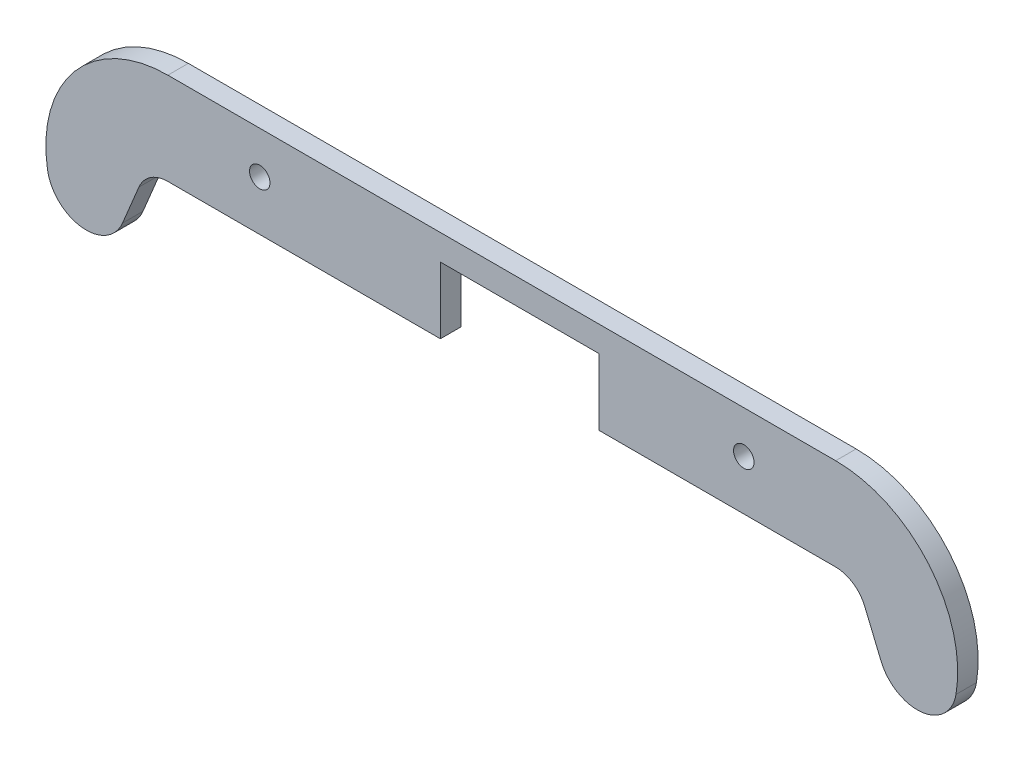
ISO-10303-21;
HEADER;
FILE_DESCRIPTION(('STEP AP214'),'2;1');
FILE_NAME('part.step','',(''),(''),'','','');
FILE_SCHEMA(('AUTOMOTIVE_DESIGN { 1 0 10303 214 1 1 1 1 }'));
ENDSEC;
DATA;
#1=APPLICATION_CONTEXT('core data for automotive mechanical design processes');
#2=APPLICATION_PROTOCOL_DEFINITION('international standard','automotive_design',2000,#1);
#3=PRODUCT_CONTEXT('',#1,'mechanical');
#4=PRODUCT('Part','Part','',(#3));
#5=PRODUCT_RELATED_PRODUCT_CATEGORY('part','',(#4));
#6=PRODUCT_DEFINITION_FORMATION('','',#4);
#7=PRODUCT_DEFINITION_CONTEXT('part definition',#1,'design');
#8=PRODUCT_DEFINITION('design','',#6,#7);
#9=PRODUCT_DEFINITION_SHAPE('','',#8);
#10=(LENGTH_UNIT() NAMED_UNIT(*) SI_UNIT(.MILLI.,.METRE.));
#11=(NAMED_UNIT(*) PLANE_ANGLE_UNIT() SI_UNIT($,.RADIAN.));
#12=(NAMED_UNIT(*) SI_UNIT($,.STERADIAN.) SOLID_ANGLE_UNIT());
#13=UNCERTAINTY_MEASURE_WITH_UNIT(LENGTH_MEASURE(1.E-05),#10,'distance_accuracy_value','');
#14=(GEOMETRIC_REPRESENTATION_CONTEXT(3) GLOBAL_UNCERTAINTY_ASSIGNED_CONTEXT((#13)) GLOBAL_UNIT_ASSIGNED_CONTEXT((#10,
#11,#12)) REPRESENTATION_CONTEXT('',''));
#15=CARTESIAN_POINT('',(0.,0.,0.));
#16=DIRECTION('',(0.,0.,1.));
#17=DIRECTION('',(1.,0.,0.));
#18=AXIS2_PLACEMENT_3D('',#15,#16,#17);
#19=CARTESIAN_POINT('',(0.,0.,4.));
#20=DIRECTION('',(0.,0.,1.));
#21=DIRECTION('',(1.,0.,0.));
#22=AXIS2_PLACEMENT_3D('',#19,#20,#21);
#23=PLANE('',#22);
#24=CARTESIAN_POINT('',(47.3247005645248,132.534767609621,4.));
#25=DIRECTION('',(0.,0.,1.));
#26=DIRECTION('',(1.,0.,0.));
#27=AXIS2_PLACEMENT_3D('',#24,#25,#26);
#28=CIRCLE('',#27,2.);
#29=CARTESIAN_POINT('',(49.3247005645248,132.534767609621,4.));
#30=VERTEX_POINT('',#29);
#31=EDGE_CURVE('E213',#30,#30,#28,.F.);
#32=ORIENTED_EDGE('',*,*,#31,.T.);
#33=EDGE_LOOP('',(#32));
#34=FACE_BOUND('',#33,.T.);
#35=CARTESIAN_POINT('',(-47.3247005645248,132.534767609621,4.));
#36=DIRECTION('',(0.,0.,1.));
#37=DIRECTION('',(1.,0.,0.));
#38=AXIS2_PLACEMENT_3D('',#35,#36,#37);
#39=CIRCLE('',#38,2.);
#40=CARTESIAN_POINT('',(-45.3247005645248,132.534767609621,4.));
#41=VERTEX_POINT('',#40);
#42=EDGE_CURVE('E208',#41,#41,#39,.T.);
#43=ORIENTED_EDGE('',*,*,#42,.F.);
#44=EDGE_LOOP('',(#43));
#45=FACE_BOUND('',#44,.T.);
#46=DIRECTION('',(1.,0.,0.));
#47=VECTOR('',#46,1.);
#48=CARTESIAN_POINT('',(0.,135.794563760221,4.));
#49=LINE('',#48,#47);
#50=CARTESIAN_POINT('',(-11.9997005645248,135.794563760221,4.));
#51=VERTEX_POINT('',#50);
#52=CARTESIAN_POINT('',(19.0002994354752,135.794563760221,4.));
#53=VERTEX_POINT('',#52);
#54=EDGE_CURVE('E266',#51,#53,#49,.T.);
#55=ORIENTED_EDGE('',*,*,#54,.T.);
#56=DIRECTION('',(0.,-1.,0.));
#57=VECTOR('',#56,1.);
#58=CARTESIAN_POINT('',(19.0002994354753,0.,4.));
#59=LINE('',#58,#57);
#60=CARTESIAN_POINT('',(19.0002994354753,122.794563760221,4.));
#61=VERTEX_POINT('',#60);
#62=EDGE_CURVE('E268',#53,#61,#59,.T.);
#63=ORIENTED_EDGE('',*,*,#62,.T.);
#64=DIRECTION('',(1.,0.,0.));
#65=VECTOR('',#64,1.);
#66=CARTESIAN_POINT('',(-1.16983781561408E-13,122.794563760221,4.));
#67=LINE('',#66,#65);
#68=CARTESIAN_POINT('',(65.2744208967918,122.794563760221,4.));
#69=VERTEX_POINT('',#68);
#70=EDGE_CURVE('E226',#61,#69,#67,.T.);
#71=ORIENTED_EDGE('',*,*,#70,.T.);
#72=CARTESIAN_POINT('',(65.2744208967918,116.631859433558,4.));
#73=DIRECTION('',(0.,0.,1.));
#74=DIRECTION('',(1.,0.,0.));
#75=AXIS2_PLACEMENT_3D('',#72,#73,#74);
#76=CIRCLE('',#75,6.16270432666299);
#77=CARTESIAN_POINT('',(70.9654319070403,118.996456291185,4.));
#78=VERTEX_POINT('',#77);
#79=EDGE_CURVE('E230',#78,#69,#76,.T.);
#80=ORIENTED_EDGE('',*,*,#79,.F.);
#81=DIRECTION('',(-0.383694678876073,0.923460011804619,0.));
#82=VECTOR('',#81,1.);
#83=CARTESIAN_POINT('',(102.681407807582,42.6637962571668,4.));
#84=LINE('',#83,#82);
#85=CARTESIAN_POINT('',(74.1610001277596,111.305498794792,4.));
#86=VERTEX_POINT('',#85);
#87=EDGE_CURVE('E233',#86,#78,#84,.T.);
#88=ORIENTED_EDGE('',*,*,#87,.F.);
#89=CARTESIAN_POINT('',(81.2513038422652,114.251497291851,4.));
#90=DIRECTION('',(0.,0.,1.));
#91=DIRECTION('',(1.,0.,0.));
#92=AXIS2_PLACEMENT_3D('',#89,#90,#91);
#93=CIRCLE('',#92,7.67797589919422);
#94=CARTESIAN_POINT('',(88.8229551594702,112.978151211921,4.));
#95=VERTEX_POINT('',#94);
#96=EDGE_CURVE('E236',#95,#86,#93,.F.);
#97=ORIENTED_EDGE('',*,*,#96,.F.);
#98=CARTESIAN_POINT('',(65.2938968592076,116.935099689332,4.));
#99=DIRECTION('',(0.,0.,1.));
#100=DIRECTION('',(1.,0.,0.));
#101=AXIS2_PLACEMENT_3D('',#98,#99,#100);
#102=CIRCLE('',#101,23.859464070889);
#103=CARTESIAN_POINT('',(65.2938968592076,140.794563760221,4.));
#104=VERTEX_POINT('',#103);
#105=EDGE_CURVE('E148',#104,#95,#102,.F.);
#106=ORIENTED_EDGE('',*,*,#105,.F.);
#107=DIRECTION('',(-1.,0.,0.));
#108=VECTOR('',#107,1.);
#109=CARTESIAN_POINT('',(0.,140.79456376022,4.));
#110=LINE('',#109,#108);
#111=CARTESIAN_POINT('',(-65.2938968592075,140.794563760221,4.));
#112=VERTEX_POINT('',#111);
#113=EDGE_CURVE('E140',#104,#112,#110,.T.);
#114=ORIENTED_EDGE('',*,*,#113,.T.);
#115=CARTESIAN_POINT('',(-65.2938968592075,116.935099689332,4.));
#116=DIRECTION('',(0.,0.,1.));
#117=DIRECTION('',(1.,0.,0.));
#118=AXIS2_PLACEMENT_3D('',#115,#116,#117);
#119=CIRCLE('',#118,23.8594640708889);
#120=CARTESIAN_POINT('',(-88.8229551594702,112.978151211921,4.));
#121=VERTEX_POINT('',#120);
#122=EDGE_CURVE('E144',#112,#121,#119,.T.);
#123=ORIENTED_EDGE('',*,*,#122,.T.);
#124=CARTESIAN_POINT('',(-81.2513038422651,114.251497291851,4.));
#125=DIRECTION('',(0.,0.,1.));
#126=DIRECTION('',(1.,0.,0.));
#127=AXIS2_PLACEMENT_3D('',#124,#125,#126);
#128=CIRCLE('',#127,7.67797589919423);
#129=CARTESIAN_POINT('',(-74.1610001277596,111.305498794792,4.));
#130=VERTEX_POINT('',#129);
#131=EDGE_CURVE('E70',#121,#130,#128,.T.);
#132=ORIENTED_EDGE('',*,*,#131,.T.);
#133=DIRECTION('',(0.383694678876073,0.923460011804619,0.));
#134=VECTOR('',#133,1.);
#135=CARTESIAN_POINT('',(-102.681407807582,42.6637962571668,4.));
#136=LINE('',#135,#134);
#137=CARTESIAN_POINT('',(-70.9654319070403,118.996456291185,4.));
#138=VERTEX_POINT('',#137);
#139=EDGE_CURVE('E192',#130,#138,#136,.T.);
#140=ORIENTED_EDGE('',*,*,#139,.T.);
#141=CARTESIAN_POINT('',(-65.2744208967917,116.631859433557,4.));
#142=DIRECTION('',(0.,0.,1.));
#143=DIRECTION('',(1.,0.,0.));
#144=AXIS2_PLACEMENT_3D('',#141,#142,#143);
#145=CIRCLE('',#144,6.16270432666299);
#146=CARTESIAN_POINT('',(-65.2744208967917,122.79456376022,4.));
#147=VERTEX_POINT('',#146);
#148=EDGE_CURVE('E117',#138,#147,#145,.F.);
#149=ORIENTED_EDGE('',*,*,#148,.T.);
#150=CARTESIAN_POINT('',(-11.9997005645248,122.794563760221,4.));
#151=VERTEX_POINT('',#150);
#152=EDGE_CURVE('E227',#147,#151,#67,.T.);
#153=ORIENTED_EDGE('',*,*,#152,.T.);
#154=DIRECTION('',(0.,1.,0.));
#155=VECTOR('',#154,1.);
#156=CARTESIAN_POINT('',(-11.9997005645248,0.,4.));
#157=LINE('',#156,#155);
#158=EDGE_CURVE('E61',#151,#51,#157,.T.);
#159=ORIENTED_EDGE('',*,*,#158,.T.);
#160=EDGE_LOOP('',(#55,#63,#71,#80,#88,#97,#106,#114,#123,#132,#140,#149,#153,#159));
#161=FACE_BOUND('',#160,.T.);
#162=ADVANCED_FACE('F44',(#34,#45,#161),#23,.T.);
#163=CARTESIAN_POINT('',(0.,0.,0.));
#164=DIRECTION('',(0.,0.,1.));
#165=DIRECTION('',(1.,0.,0.));
#166=AXIS2_PLACEMENT_3D('',#163,#164,#165);
#167=PLANE('',#166);
#168=CARTESIAN_POINT('',(-47.3247005645248,132.534767609621,0.));
#169=DIRECTION('',(0.,0.,1.));
#170=DIRECTION('',(1.,0.,0.));
#171=AXIS2_PLACEMENT_3D('',#168,#169,#170);
#172=CIRCLE('',#171,2.);
#173=CARTESIAN_POINT('',(-45.3247005645248,132.534767609621,0.));
#174=VERTEX_POINT('',#173);
#175=EDGE_CURVE('E48',#174,#174,#172,.T.);
#176=ORIENTED_EDGE('',*,*,#175,.T.);
#177=EDGE_LOOP('',(#176));
#178=FACE_BOUND('',#177,.T.);
#179=CARTESIAN_POINT('',(47.3247005645248,132.534767609621,0.));
#180=DIRECTION('',(0.,0.,1.));
#181=DIRECTION('',(1.,0.,0.));
#182=AXIS2_PLACEMENT_3D('',#179,#180,#181);
#183=CIRCLE('',#182,2.);
#184=CARTESIAN_POINT('',(49.3247005645248,132.534767609621,0.));
#185=VERTEX_POINT('',#184);
#186=EDGE_CURVE('E206',#185,#185,#183,.F.);
#187=ORIENTED_EDGE('',*,*,#186,.F.);
#188=EDGE_LOOP('',(#187));
#189=FACE_BOUND('',#188,.T.);
#190=DIRECTION('',(0.,-1.,0.));
#191=VECTOR('',#190,1.);
#192=CARTESIAN_POINT('',(19.0002994354753,0.,0.));
#193=LINE('',#192,#191);
#194=CARTESIAN_POINT('',(19.0002994354752,135.794563760221,0.));
#195=VERTEX_POINT('',#194);
#196=CARTESIAN_POINT('',(19.0002994354753,122.794563760221,0.));
#197=VERTEX_POINT('',#196);
#198=EDGE_CURVE('E265',#195,#197,#193,.T.);
#199=ORIENTED_EDGE('',*,*,#198,.F.);
#200=DIRECTION('',(1.,0.,0.));
#201=VECTOR('',#200,1.);
#202=CARTESIAN_POINT('',(0.,135.794563760221,0.));
#203=LINE('',#202,#201);
#204=CARTESIAN_POINT('',(-11.9997005645248,135.794563760221,0.));
#205=VERTEX_POINT('',#204);
#206=EDGE_CURVE('E273',#205,#195,#203,.T.);
#207=ORIENTED_EDGE('',*,*,#206,.F.);
#208=DIRECTION('',(0.,1.,0.));
#209=VECTOR('',#208,1.);
#210=CARTESIAN_POINT('',(-11.9997005645248,0.,0.));
#211=LINE('',#210,#209);
#212=CARTESIAN_POINT('',(-11.9997005645248,122.794563760221,0.));
#213=VERTEX_POINT('',#212);
#214=EDGE_CURVE('E271',#213,#205,#211,.T.);
#215=ORIENTED_EDGE('',*,*,#214,.F.);
#216=DIRECTION('',(1.,0.,0.));
#217=VECTOR('',#216,1.);
#218=CARTESIAN_POINT('',(-1.16983781561408E-13,122.794563760221,0.));
#219=LINE('',#218,#217);
#220=CARTESIAN_POINT('',(-65.2744208967917,122.79456376022,0.));
#221=VERTEX_POINT('',#220);
#222=EDGE_CURVE('E173',#221,#213,#219,.T.);
#223=ORIENTED_EDGE('',*,*,#222,.F.);
#224=CARTESIAN_POINT('',(-65.2744208967917,116.631859433557,0.));
#225=DIRECTION('',(0.,0.,1.));
#226=DIRECTION('',(1.,0.,0.));
#227=AXIS2_PLACEMENT_3D('',#224,#225,#226);
#228=CIRCLE('',#227,6.16270432666299);
#229=CARTESIAN_POINT('',(-70.9654319070403,118.996456291185,0.));
#230=VERTEX_POINT('',#229);
#231=EDGE_CURVE('E170',#230,#221,#228,.F.);
#232=ORIENTED_EDGE('',*,*,#231,.F.);
#233=DIRECTION('',(0.383694678876073,0.923460011804619,0.));
#234=VECTOR('',#233,1.);
#235=CARTESIAN_POINT('',(-102.681407807582,42.6637962571668,0.));
#236=LINE('',#235,#234);
#237=CARTESIAN_POINT('',(-74.1610001277596,111.305498794792,0.));
#238=VERTEX_POINT('',#237);
#239=EDGE_CURVE('E167',#238,#230,#236,.T.);
#240=ORIENTED_EDGE('',*,*,#239,.F.);
#241=CARTESIAN_POINT('',(-81.2513038422651,114.251497291851,0.));
#242=DIRECTION('',(0.,0.,1.));
#243=DIRECTION('',(1.,0.,0.));
#244=AXIS2_PLACEMENT_3D('',#241,#242,#243);
#245=CIRCLE('',#244,7.67797589919423);
#246=CARTESIAN_POINT('',(-88.8229551594702,112.978151211921,0.));
#247=VERTEX_POINT('',#246);
#248=EDGE_CURVE('E109',#247,#238,#245,.T.);
#249=ORIENTED_EDGE('',*,*,#248,.F.);
#250=CARTESIAN_POINT('',(-65.2938968592075,116.935099689332,0.));
#251=DIRECTION('',(0.,0.,1.));
#252=DIRECTION('',(1.,0.,0.));
#253=AXIS2_PLACEMENT_3D('',#250,#251,#252);
#254=CIRCLE('',#253,23.8594640708889);
#255=CARTESIAN_POINT('',(-65.2938968592075,140.794563760221,0.));
#256=VERTEX_POINT('',#255);
#257=EDGE_CURVE('E189',#256,#247,#254,.T.);
#258=ORIENTED_EDGE('',*,*,#257,.F.);
#259=DIRECTION('',(-1.,0.,0.));
#260=VECTOR('',#259,1.);
#261=CARTESIAN_POINT('',(0.,140.79456376022,0.));
#262=LINE('',#261,#260);
#263=CARTESIAN_POINT('',(65.2938968592076,140.794563760221,0.));
#264=VERTEX_POINT('',#263);
#265=EDGE_CURVE('E155',#264,#256,#262,.T.);
#266=ORIENTED_EDGE('',*,*,#265,.F.);
#267=CARTESIAN_POINT('',(65.2938968592076,116.935099689332,0.));
#268=DIRECTION('',(0.,0.,1.));
#269=DIRECTION('',(1.,0.,0.));
#270=AXIS2_PLACEMENT_3D('',#267,#268,#269);
#271=CIRCLE('',#270,23.859464070889);
#272=CARTESIAN_POINT('',(88.8229551594702,112.978151211921,0.));
#273=VERTEX_POINT('',#272);
#274=EDGE_CURVE('E185',#264,#273,#271,.F.);
#275=ORIENTED_EDGE('',*,*,#274,.T.);
#276=CARTESIAN_POINT('',(81.2513038422652,114.251497291851,0.));
#277=DIRECTION('',(0.,0.,1.));
#278=DIRECTION('',(1.,0.,0.));
#279=AXIS2_PLACEMENT_3D('',#276,#277,#278);
#280=CIRCLE('',#279,7.67797589919422);
#281=CARTESIAN_POINT('',(74.1610001277596,111.305498794792,0.));
#282=VERTEX_POINT('',#281);
#283=EDGE_CURVE('E182',#273,#282,#280,.F.);
#284=ORIENTED_EDGE('',*,*,#283,.T.);
#285=DIRECTION('',(-0.383694678876073,0.923460011804619,0.));
#286=VECTOR('',#285,1.);
#287=CARTESIAN_POINT('',(102.681407807582,42.6637962571668,0.));
#288=LINE('',#287,#286);
#289=CARTESIAN_POINT('',(70.9654319070403,118.996456291185,0.));
#290=VERTEX_POINT('',#289);
#291=EDGE_CURVE('E179',#282,#290,#288,.T.);
#292=ORIENTED_EDGE('',*,*,#291,.T.);
#293=CARTESIAN_POINT('',(65.2744208967918,116.631859433558,0.));
#294=DIRECTION('',(0.,0.,1.));
#295=DIRECTION('',(1.,0.,0.));
#296=AXIS2_PLACEMENT_3D('',#293,#294,#295);
#297=CIRCLE('',#296,6.16270432666299);
#298=CARTESIAN_POINT('',(65.2744208967918,122.794563760221,0.));
#299=VERTEX_POINT('',#298);
#300=EDGE_CURVE('E176',#290,#299,#297,.T.);
#301=ORIENTED_EDGE('',*,*,#300,.T.);
#302=EDGE_CURVE('E172',#197,#299,#219,.T.);
#303=ORIENTED_EDGE('',*,*,#302,.F.);
#304=EDGE_LOOP('',(#199,#207,#215,#223,#232,#240,#249,#258,#266,#275,#284,#292,#301,#303));
#305=FACE_BOUND('',#304,.T.);
#306=ADVANCED_FACE('F244',(#178,#189,#305),#167,.F.);
#307=CARTESIAN_POINT('',(-1.16983781561408E-13,122.794563760221,4.));
#308=DIRECTION('',(0.,1.,0.));
#309=DIRECTION('',(-1.,0.,0.));
#310=AXIS2_PLACEMENT_3D('',#307,#308,#309);
#311=PLANE('',#310);
#312=DIRECTION('',(0.,0.,1.));
#313=VECTOR('',#312,1.);
#314=CARTESIAN_POINT('',(19.0002994354753,122.794563760221,0.));
#315=LINE('',#314,#313);
#316=EDGE_CURVE('E218',#197,#61,#315,.T.);
#317=ORIENTED_EDGE('',*,*,#316,.F.);
#318=ORIENTED_EDGE('',*,*,#302,.T.);
#319=DIRECTION('',(0.,0.,-1.));
#320=VECTOR('',#319,1.);
#321=CARTESIAN_POINT('',(65.2744208967918,122.794563760221,4.));
#322=LINE('',#321,#320);
#323=EDGE_CURVE('E202',#69,#299,#322,.T.);
#324=ORIENTED_EDGE('',*,*,#323,.F.);
#325=ORIENTED_EDGE('',*,*,#70,.F.);
#326=EDGE_LOOP('',(#317,#318,#324,#325));
#327=FACE_BOUND('',#326,.T.);
#328=ADVANCED_FACE('F289',(#327),#311,.F.);
#329=DIRECTION('',(0.,0.,1.));
#330=VECTOR('',#329,1.);
#331=CARTESIAN_POINT('',(-11.9997005645248,122.794563760221,0.));
#332=LINE('',#331,#330);
#333=EDGE_CURVE('E255',#213,#151,#332,.T.);
#334=ORIENTED_EDGE('',*,*,#333,.T.);
#335=ORIENTED_EDGE('',*,*,#152,.F.);
#336=DIRECTION('',(0.,0.,-1.));
#337=VECTOR('',#336,1.);
#338=CARTESIAN_POINT('',(-65.2744208967917,122.79456376022,4.));
#339=LINE('',#338,#337);
#340=EDGE_CURVE('E53',#147,#221,#339,.T.);
#341=ORIENTED_EDGE('',*,*,#340,.T.);
#342=ORIENTED_EDGE('',*,*,#222,.T.);
#343=EDGE_LOOP('',(#334,#335,#341,#342));
#344=FACE_BOUND('',#343,.T.);
#345=ADVANCED_FACE('F254',(#344),#311,.F.);
#346=CARTESIAN_POINT('',(-102.681407807582,42.6637962571668,4.));
#347=DIRECTION('',(-0.923460011804619,0.383694678876073,0.));
#348=DIRECTION('',(-0.383694678876073,-0.923460011804619,0.));
#349=AXIS2_PLACEMENT_3D('',#346,#347,#348);
#350=PLANE('',#349);
#351=ORIENTED_EDGE('',*,*,#239,.T.);
#352=DIRECTION('',(0.,0.,-1.));
#353=VECTOR('',#352,1.);
#354=CARTESIAN_POINT('',(-70.9654319070403,118.996456291185,4.));
#355=LINE('',#354,#353);
#356=EDGE_CURVE('E11',#138,#230,#355,.T.);
#357=ORIENTED_EDGE('',*,*,#356,.F.);
#358=ORIENTED_EDGE('',*,*,#139,.F.);
#359=DIRECTION('',(0.,0.,-1.));
#360=VECTOR('',#359,1.);
#361=CARTESIAN_POINT('',(-74.1610001277596,111.305498794792,4.));
#362=LINE('',#361,#360);
#363=EDGE_CURVE('E163',#130,#238,#362,.T.);
#364=ORIENTED_EDGE('',*,*,#363,.T.);
#365=EDGE_LOOP('',(#351,#357,#358,#364));
#366=FACE_BOUND('',#365,.T.);
#367=ADVANCED_FACE('F46',(#366),#350,.F.);
#368=CARTESIAN_POINT('',(-65.2744208967917,116.631859433557,4.));
#369=DIRECTION('',(0.,0.,-1.));
#370=DIRECTION('',(-1.,0.,0.));
#371=AXIS2_PLACEMENT_3D('',#368,#369,#370);
#372=CYLINDRICAL_SURFACE('',#371,6.16270432666299);
#373=ORIENTED_EDGE('',*,*,#231,.T.);
#374=ORIENTED_EDGE('',*,*,#340,.F.);
#375=ORIENTED_EDGE('',*,*,#148,.F.);
#376=ORIENTED_EDGE('',*,*,#356,.T.);
#377=EDGE_LOOP('',(#373,#374,#375,#376));
#378=FACE_BOUND('',#377,.T.);
#379=ADVANCED_FACE('F251',(#378),#372,.F.);
#380=CARTESIAN_POINT('',(65.2744208967918,116.631859433558,4.));
#381=DIRECTION('',(0.,0.,-1.));
#382=DIRECTION('',(-1.,0.,0.));
#383=AXIS2_PLACEMENT_3D('',#380,#381,#382);
#384=CYLINDRICAL_SURFACE('',#383,6.16270432666299);
#385=ORIENTED_EDGE('',*,*,#300,.F.);
#386=DIRECTION('',(0.,0.,-1.));
#387=VECTOR('',#386,1.);
#388=CARTESIAN_POINT('',(70.9654319070403,118.996456291185,4.));
#389=LINE('',#388,#387);
#390=EDGE_CURVE('E200',#78,#290,#389,.T.);
#391=ORIENTED_EDGE('',*,*,#390,.F.);
#392=ORIENTED_EDGE('',*,*,#79,.T.);
#393=ORIENTED_EDGE('',*,*,#323,.T.);
#394=EDGE_LOOP('',(#385,#391,#392,#393));
#395=FACE_BOUND('',#394,.T.);
#396=ADVANCED_FACE('F294',(#395),#384,.F.);
#397=CARTESIAN_POINT('',(102.681407807582,42.6637962571668,4.));
#398=DIRECTION('',(-0.923460011804619,-0.383694678876073,0.));
#399=DIRECTION('',(0.383694678876073,-0.923460011804619,0.));
#400=AXIS2_PLACEMENT_3D('',#397,#398,#399);
#401=PLANE('',#400);
#402=ORIENTED_EDGE('',*,*,#291,.F.);
#403=DIRECTION('',(0.,0.,-1.));
#404=VECTOR('',#403,1.);
#405=CARTESIAN_POINT('',(74.1610001277596,111.305498794792,4.));
#406=LINE('',#405,#404);
#407=EDGE_CURVE('E198',#86,#282,#406,.T.);
#408=ORIENTED_EDGE('',*,*,#407,.F.);
#409=ORIENTED_EDGE('',*,*,#87,.T.);
#410=ORIENTED_EDGE('',*,*,#390,.T.);
#411=EDGE_LOOP('',(#402,#408,#409,#410));
#412=FACE_BOUND('',#411,.T.);
#413=ADVANCED_FACE('F298',(#412),#401,.T.);
#414=CARTESIAN_POINT('',(81.2513038422652,114.251497291851,4.));
#415=DIRECTION('',(0.,0.,-1.));
#416=DIRECTION('',(-1.,0.,0.));
#417=AXIS2_PLACEMENT_3D('',#414,#415,#416);
#418=CYLINDRICAL_SURFACE('',#417,7.67797589919422);
#419=ORIENTED_EDGE('',*,*,#283,.F.);
#420=DIRECTION('',(0.,0.,-1.));
#421=VECTOR('',#420,1.);
#422=CARTESIAN_POINT('',(88.8229551594702,112.978151211921,4.));
#423=LINE('',#422,#421);
#424=EDGE_CURVE('E196',#95,#273,#423,.T.);
#425=ORIENTED_EDGE('',*,*,#424,.F.);
#426=ORIENTED_EDGE('',*,*,#96,.T.);
#427=ORIENTED_EDGE('',*,*,#407,.T.);
#428=EDGE_LOOP('',(#419,#425,#426,#427));
#429=FACE_BOUND('',#428,.T.);
#430=ADVANCED_FACE('F300',(#429),#418,.T.);
#431=CARTESIAN_POINT('',(65.2938968592076,116.935099689332,4.));
#432=DIRECTION('',(0.,0.,-1.));
#433=DIRECTION('',(-1.,0.,0.));
#434=AXIS2_PLACEMENT_3D('',#431,#432,#433);
#435=CYLINDRICAL_SURFACE('',#434,23.859464070889);
#436=ORIENTED_EDGE('',*,*,#274,.F.);
#437=DIRECTION('',(0.,0.,-1.));
#438=VECTOR('',#437,1.);
#439=CARTESIAN_POINT('',(65.2938968592076,140.794563760221,4.));
#440=LINE('',#439,#438);
#441=EDGE_CURVE('E158',#104,#264,#440,.T.);
#442=ORIENTED_EDGE('',*,*,#441,.F.);
#443=ORIENTED_EDGE('',*,*,#105,.T.);
#444=ORIENTED_EDGE('',*,*,#424,.T.);
#445=EDGE_LOOP('',(#436,#442,#443,#444));
#446=FACE_BOUND('',#445,.T.);
#447=ADVANCED_FACE('F240',(#446),#435,.T.);
#448=CARTESIAN_POINT('',(0.,140.79456376022,4.));
#449=DIRECTION('',(0.,-1.,0.));
#450=DIRECTION('',(0.,0.,-1.));
#451=AXIS2_PLACEMENT_3D('',#448,#449,#450);
#452=PLANE('',#451);
#453=ORIENTED_EDGE('',*,*,#265,.T.);
#454=DIRECTION('',(0.,0.,-1.));
#455=VECTOR('',#454,1.);
#456=CARTESIAN_POINT('',(-65.2938968592075,140.794563760221,4.));
#457=LINE('',#456,#455);
#458=EDGE_CURVE('E152',#112,#256,#457,.T.);
#459=ORIENTED_EDGE('',*,*,#458,.F.);
#460=ORIENTED_EDGE('',*,*,#113,.F.);
#461=ORIENTED_EDGE('',*,*,#441,.T.);
#462=EDGE_LOOP('',(#453,#459,#460,#461));
#463=FACE_BOUND('',#462,.T.);
#464=ADVANCED_FACE('F153',(#463),#452,.F.);
#465=CARTESIAN_POINT('',(-65.2938968592075,116.935099689332,4.));
#466=DIRECTION('',(0.,0.,-1.));
#467=DIRECTION('',(-1.,0.,0.));
#468=AXIS2_PLACEMENT_3D('',#465,#466,#467);
#469=CYLINDRICAL_SURFACE('',#468,23.8594640708889);
#470=ORIENTED_EDGE('',*,*,#257,.T.);
#471=DIRECTION('',(0.,0.,-1.));
#472=VECTOR('',#471,1.);
#473=CARTESIAN_POINT('',(-88.8229551594702,112.978151211921,4.));
#474=LINE('',#473,#472);
#475=EDGE_CURVE('E159',#121,#247,#474,.T.);
#476=ORIENTED_EDGE('',*,*,#475,.F.);
#477=ORIENTED_EDGE('',*,*,#122,.F.);
#478=ORIENTED_EDGE('',*,*,#458,.T.);
#479=EDGE_LOOP('',(#470,#476,#477,#478));
#480=FACE_BOUND('',#479,.T.);
#481=ADVANCED_FACE('F161',(#480),#469,.T.);
#482=CARTESIAN_POINT('',(-81.2513038422651,114.251497291851,4.));
#483=DIRECTION('',(0.,0.,-1.));
#484=DIRECTION('',(-1.,0.,0.));
#485=AXIS2_PLACEMENT_3D('',#482,#483,#484);
#486=CYLINDRICAL_SURFACE('',#485,7.67797589919423);
#487=ORIENTED_EDGE('',*,*,#248,.T.);
#488=ORIENTED_EDGE('',*,*,#363,.F.);
#489=ORIENTED_EDGE('',*,*,#131,.F.);
#490=ORIENTED_EDGE('',*,*,#475,.T.);
#491=EDGE_LOOP('',(#487,#488,#489,#490));
#492=FACE_BOUND('',#491,.T.);
#493=ADVANCED_FACE('F246',(#492),#486,.T.);
#494=CARTESIAN_POINT('',(47.3247005645248,132.534767609621,-6.));
#495=DIRECTION('',(0.,0.,1.));
#496=DIRECTION('',(1.,0.,0.));
#497=AXIS2_PLACEMENT_3D('',#494,#495,#496);
#498=CYLINDRICAL_SURFACE('',#497,2.);
#499=ORIENTED_EDGE('',*,*,#31,.F.);
#500=EDGE_LOOP('',(#499));
#501=FACE_BOUND('',#500,.T.);
#502=ORIENTED_EDGE('',*,*,#186,.T.);
#503=EDGE_LOOP('',(#502));
#504=FACE_BOUND('',#503,.T.);
#505=ADVANCED_FACE('F320',(#501,#504),#498,.F.);
#506=CARTESIAN_POINT('',(-47.3247005645248,132.534767609621,-6.));
#507=DIRECTION('',(0.,0.,1.));
#508=DIRECTION('',(1.,0.,0.));
#509=AXIS2_PLACEMENT_3D('',#506,#507,#508);
#510=CYLINDRICAL_SURFACE('',#509,2.);
#511=ORIENTED_EDGE('',*,*,#42,.T.);
#512=EDGE_LOOP('',(#511));
#513=FACE_BOUND('',#512,.T.);
#514=ORIENTED_EDGE('',*,*,#175,.F.);
#515=EDGE_LOOP('',(#514));
#516=FACE_BOUND('',#515,.T.);
#517=ADVANCED_FACE('F346',(#513,#516),#510,.F.);
#518=CARTESIAN_POINT('',(19.0002994354753,0.,0.));
#519=DIRECTION('',(-1.,0.,0.));
#520=DIRECTION('',(0.,-1.,0.));
#521=AXIS2_PLACEMENT_3D('',#518,#519,#520);
#522=PLANE('',#521);
#523=ORIENTED_EDGE('',*,*,#62,.F.);
#524=DIRECTION('',(0.,0.,1.));
#525=VECTOR('',#524,1.);
#526=CARTESIAN_POINT('',(19.0002994354752,135.794563760221,0.));
#527=LINE('',#526,#525);
#528=EDGE_CURVE('E221',#195,#53,#527,.T.);
#529=ORIENTED_EDGE('',*,*,#528,.F.);
#530=ORIENTED_EDGE('',*,*,#198,.T.);
#531=ORIENTED_EDGE('',*,*,#316,.T.);
#532=EDGE_LOOP('',(#523,#529,#530,#531));
#533=FACE_BOUND('',#532,.T.);
#534=ADVANCED_FACE('F281',(#533),#522,.T.);
#535=CARTESIAN_POINT('',(-11.9997005645248,0.,0.));
#536=DIRECTION('',(1.,0.,0.));
#537=DIRECTION('',(0.,0.,-1.));
#538=AXIS2_PLACEMENT_3D('',#535,#536,#537);
#539=PLANE('',#538);
#540=ORIENTED_EDGE('',*,*,#158,.F.);
#541=ORIENTED_EDGE('',*,*,#333,.F.);
#542=ORIENTED_EDGE('',*,*,#214,.T.);
#543=DIRECTION('',(0.,0.,1.));
#544=VECTOR('',#543,1.);
#545=CARTESIAN_POINT('',(-11.9997005645248,135.794563760221,0.));
#546=LINE('',#545,#544);
#547=EDGE_CURVE('E259',#205,#51,#546,.T.);
#548=ORIENTED_EDGE('',*,*,#547,.T.);
#549=EDGE_LOOP('',(#540,#541,#542,#548));
#550=FACE_BOUND('',#549,.T.);
#551=ADVANCED_FACE('F385',(#550),#539,.T.);
#552=CARTESIAN_POINT('',(0.,135.794563760221,0.));
#553=DIRECTION('',(0.,-1.,0.));
#554=DIRECTION('',(0.,0.,-1.));
#555=AXIS2_PLACEMENT_3D('',#552,#553,#554);
#556=PLANE('',#555);
#557=ORIENTED_EDGE('',*,*,#54,.F.);
#558=ORIENTED_EDGE('',*,*,#547,.F.);
#559=ORIENTED_EDGE('',*,*,#206,.T.);
#560=ORIENTED_EDGE('',*,*,#528,.T.);
#561=EDGE_LOOP('',(#557,#558,#559,#560));
#562=FACE_BOUND('',#561,.T.);
#563=ADVANCED_FACE('F392',(#562),#556,.T.);
#564=CLOSED_SHELL('',(#162,#306,#328,#345,#367,#379,#396,#413,#430,#447,#464,#481,#493,#505,
#517,#534,#551,#563));
#565=MANIFOLD_SOLID_BREP('B2',#564);
#566=ADVANCED_BREP_SHAPE_REPRESENTATION('',(#18,#565),#14);
#567=SHAPE_DEFINITION_REPRESENTATION(#9,#566);
ENDSEC;
END-ISO-10303-21;
